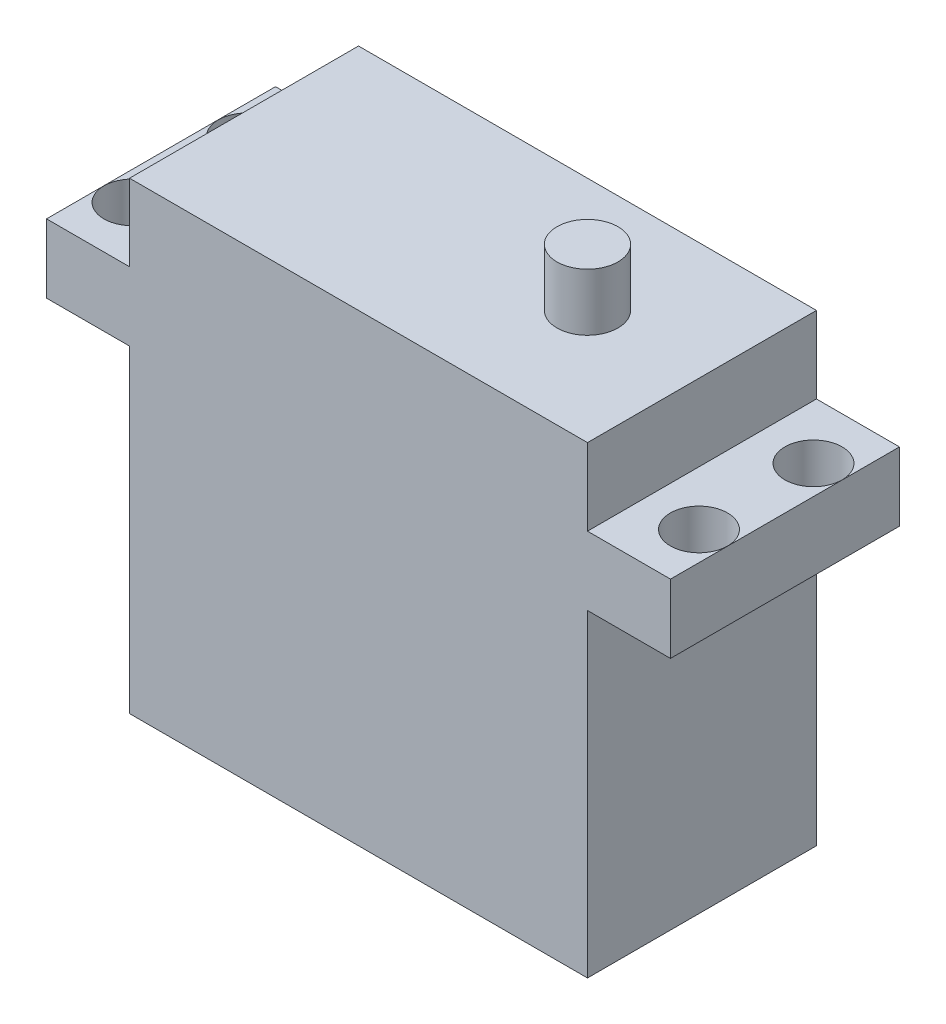
ISO-10303-21;
HEADER;
FILE_DESCRIPTION(('STEP AP214'),'2;1');
FILE_NAME('part.step','',(''),(''),'','','');
FILE_SCHEMA(('AUTOMOTIVE_DESIGN { 1 0 10303 214 1 1 1 1 }'));
ENDSEC;
DATA;
#1=APPLICATION_CONTEXT('core data for automotive mechanical design processes');
#2=APPLICATION_PROTOCOL_DEFINITION('international standard','automotive_design',2000,#1);
#3=PRODUCT_CONTEXT('',#1,'mechanical');
#4=PRODUCT('Part','Part','',(#3));
#5=PRODUCT_RELATED_PRODUCT_CATEGORY('part','',(#4));
#6=PRODUCT_DEFINITION_FORMATION('','',#4);
#7=PRODUCT_DEFINITION_CONTEXT('part definition',#1,'design');
#8=PRODUCT_DEFINITION('design','',#6,#7);
#9=PRODUCT_DEFINITION_SHAPE('','',#8);
#10=(LENGTH_UNIT() NAMED_UNIT(*) SI_UNIT(.MILLI.,.METRE.));
#11=(NAMED_UNIT(*) PLANE_ANGLE_UNIT() SI_UNIT($,.RADIAN.));
#12=(NAMED_UNIT(*) SI_UNIT($,.STERADIAN.) SOLID_ANGLE_UNIT());
#13=UNCERTAINTY_MEASURE_WITH_UNIT(LENGTH_MEASURE(1.E-05),#10,'distance_accuracy_value','');
#14=(GEOMETRIC_REPRESENTATION_CONTEXT(3) GLOBAL_UNCERTAINTY_ASSIGNED_CONTEXT((#13)) GLOBAL_UNIT_ASSIGNED_CONTEXT((#10,
#11,#12)) REPRESENTATION_CONTEXT('',''));
#15=CARTESIAN_POINT('',(0.,0.,0.));
#16=DIRECTION('',(0.,0.,1.));
#17=DIRECTION('',(1.,0.,0.));
#18=AXIS2_PLACEMENT_3D('',#15,#16,#17);
#19=CARTESIAN_POINT('',(20.,40.5,0.));
#20=DIRECTION('',(-1.,0.,0.));
#21=DIRECTION('',(0.,0.,1.));
#22=AXIS2_PLACEMENT_3D('',#19,#20,#21);
#23=PLANE('',#22);
#24=DIRECTION('',(0.,0.,-1.));
#25=VECTOR('',#24,1.);
#26=CARTESIAN_POINT('',(20.,27.8,0.));
#27=LINE('',#26,#25);
#28=CARTESIAN_POINT('',(20.,27.8,10.));
#29=VERTEX_POINT('',#28);
#30=CARTESIAN_POINT('',(20.,27.8,-10.));
#31=VERTEX_POINT('',#30);
#32=EDGE_CURVE('E261',#29,#31,#27,.T.);
#33=ORIENTED_EDGE('',*,*,#32,.F.);
#34=DIRECTION('',(0.,-1.,0.));
#35=VECTOR('',#34,1.);
#36=CARTESIAN_POINT('',(20.,40.5,10.));
#37=LINE('',#36,#35);
#38=CARTESIAN_POINT('',(20.,0.,10.));
#39=VERTEX_POINT('',#38);
#40=EDGE_CURVE('E49',#29,#39,#37,.T.);
#41=ORIENTED_EDGE('',*,*,#40,.T.);
#42=DIRECTION('',(0.,0.,-1.));
#43=VECTOR('',#42,1.);
#44=CARTESIAN_POINT('',(20.,0.,0.));
#45=LINE('',#44,#43);
#46=CARTESIAN_POINT('',(20.,0.,-10.));
#47=VERTEX_POINT('',#46);
#48=EDGE_CURVE('E176',#39,#47,#45,.T.);
#49=ORIENTED_EDGE('',*,*,#48,.T.);
#50=DIRECTION('',(0.,-1.,0.));
#51=VECTOR('',#50,1.);
#52=CARTESIAN_POINT('',(20.,40.5,-10.));
#53=LINE('',#52,#51);
#54=EDGE_CURVE('E185',#31,#47,#53,.T.);
#55=ORIENTED_EDGE('',*,*,#54,.F.);
#56=EDGE_LOOP('',(#33,#41,#49,#55));
#57=FACE_BOUND('',#56,.T.);
#58=ADVANCED_FACE('F41',(#57),#23,.F.);
#59=CARTESIAN_POINT('',(-20.,40.5,0.));
#60=DIRECTION('',(-1.,0.,0.));
#61=DIRECTION('',(0.,0.,1.));
#62=AXIS2_PLACEMENT_3D('',#59,#60,#61);
#63=PLANE('',#62);
#64=DIRECTION('',(0.,-1.,0.));
#65=VECTOR('',#64,1.);
#66=CARTESIAN_POINT('',(-20.,40.5,10.));
#67=LINE('',#66,#65);
#68=CARTESIAN_POINT('',(-20.,27.8,10.));
#69=VERTEX_POINT('',#68);
#70=CARTESIAN_POINT('',(-20.,0.,10.));
#71=VERTEX_POINT('',#70);
#72=EDGE_CURVE('E173',#69,#71,#67,.T.);
#73=ORIENTED_EDGE('',*,*,#72,.F.);
#74=DIRECTION('',(0.,0.,-1.));
#75=VECTOR('',#74,1.);
#76=CARTESIAN_POINT('',(-20.,27.8,0.));
#77=LINE('',#76,#75);
#78=CARTESIAN_POINT('',(-20.,27.8,-10.));
#79=VERTEX_POINT('',#78);
#80=EDGE_CURVE('E64',#69,#79,#77,.T.);
#81=ORIENTED_EDGE('',*,*,#80,.T.);
#82=DIRECTION('',(0.,-1.,0.));
#83=VECTOR('',#82,1.);
#84=CARTESIAN_POINT('',(-20.,40.5,-10.));
#85=LINE('',#84,#83);
#86=CARTESIAN_POINT('',(-20.,0.,-10.));
#87=VERTEX_POINT('',#86);
#88=EDGE_CURVE('E183',#79,#87,#85,.T.);
#89=ORIENTED_EDGE('',*,*,#88,.T.);
#90=DIRECTION('',(0.,0.,-1.));
#91=VECTOR('',#90,1.);
#92=CARTESIAN_POINT('',(-20.,0.,0.));
#93=LINE('',#92,#91);
#94=EDGE_CURVE('E162',#71,#87,#93,.T.);
#95=ORIENTED_EDGE('',*,*,#94,.F.);
#96=EDGE_LOOP('',(#73,#81,#89,#95));
#97=FACE_BOUND('',#96,.T.);
#98=ADVANCED_FACE('F201',(#97),#63,.T.);
#99=CARTESIAN_POINT('',(0.,40.5,10.));
#100=DIRECTION('',(0.,0.,-1.));
#101=DIRECTION('',(-1.,0.,0.));
#102=AXIS2_PLACEMENT_3D('',#99,#100,#101);
#103=PLANE('',#102);
#104=DIRECTION('',(1.,0.,0.));
#105=VECTOR('',#104,1.);
#106=CARTESIAN_POINT('',(0.,0.,10.));
#107=LINE('',#106,#105);
#108=EDGE_CURVE('E174',#71,#39,#107,.T.);
#109=ORIENTED_EDGE('',*,*,#108,.T.);
#110=ORIENTED_EDGE('',*,*,#40,.F.);
#111=DIRECTION('',(1.,0.,0.));
#112=VECTOR('',#111,1.);
#113=CARTESIAN_POINT('',(0.,27.8,10.));
#114=LINE('',#113,#112);
#115=CARTESIAN_POINT('',(27.25,27.8,10.));
#116=VERTEX_POINT('',#115);
#117=EDGE_CURVE('E259',#29,#116,#114,.T.);
#118=ORIENTED_EDGE('',*,*,#117,.T.);
#119=DIRECTION('',(0.,-1.,0.));
#120=VECTOR('',#119,1.);
#121=CARTESIAN_POINT('',(27.25,33.8,10.));
#122=LINE('',#121,#120);
#123=CARTESIAN_POINT('',(27.25,33.8,10.));
#124=VERTEX_POINT('',#123);
#125=EDGE_CURVE('E137',#124,#116,#122,.T.);
#126=ORIENTED_EDGE('',*,*,#125,.F.);
#127=DIRECTION('',(1.,0.,0.));
#128=VECTOR('',#127,1.);
#129=CARTESIAN_POINT('',(0.,33.8,10.));
#130=LINE('',#129,#128);
#131=CARTESIAN_POINT('',(20.,33.8,10.));
#132=VERTEX_POINT('',#131);
#133=EDGE_CURVE('E132',#132,#124,#130,.T.);
#134=ORIENTED_EDGE('',*,*,#133,.F.);
#135=CARTESIAN_POINT('',(20.,40.5,10.));
#136=VERTEX_POINT('',#135);
#137=EDGE_CURVE('E11',#136,#132,#37,.T.);
#138=ORIENTED_EDGE('',*,*,#137,.F.);
#139=DIRECTION('',(1.,0.,0.));
#140=VECTOR('',#139,1.);
#141=CARTESIAN_POINT('',(0.,40.5,10.));
#142=LINE('',#141,#140);
#143=CARTESIAN_POINT('',(-20.,40.5,10.));
#144=VERTEX_POINT('',#143);
#145=EDGE_CURVE('E155',#144,#136,#142,.T.);
#146=ORIENTED_EDGE('',*,*,#145,.F.);
#147=CARTESIAN_POINT('',(-20.,33.8,10.));
#148=VERTEX_POINT('',#147);
#149=EDGE_CURVE('E181',#144,#148,#67,.T.);
#150=ORIENTED_EDGE('',*,*,#149,.T.);
#151=DIRECTION('',(1.,0.,0.));
#152=VECTOR('',#151,1.);
#153=CARTESIAN_POINT('',(0.,33.8,10.));
#154=LINE('',#153,#152);
#155=CARTESIAN_POINT('',(-27.25,33.8,10.));
#156=VERTEX_POINT('',#155);
#157=EDGE_CURVE('E242',#156,#148,#154,.T.);
#158=ORIENTED_EDGE('',*,*,#157,.F.);
#159=DIRECTION('',(0.,-1.,0.));
#160=VECTOR('',#159,1.);
#161=CARTESIAN_POINT('',(-27.25,33.8,10.));
#162=LINE('',#161,#160);
#163=CARTESIAN_POINT('',(-27.25,27.8,10.));
#164=VERTEX_POINT('',#163);
#165=EDGE_CURVE('E218',#156,#164,#162,.T.);
#166=ORIENTED_EDGE('',*,*,#165,.T.);
#167=DIRECTION('',(1.,0.,0.));
#168=VECTOR('',#167,1.);
#169=CARTESIAN_POINT('',(0.,27.8,10.));
#170=LINE('',#169,#168);
#171=EDGE_CURVE('E215',#164,#69,#170,.T.);
#172=ORIENTED_EDGE('',*,*,#171,.T.);
#173=ORIENTED_EDGE('',*,*,#72,.T.);
#174=EDGE_LOOP('',(#109,#110,#118,#126,#134,#138,#146,#150,#158,#166,#172,#173));
#175=FACE_BOUND('',#174,.T.);
#176=ADVANCED_FACE('F43',(#175),#103,.F.);
#177=ORIENTED_EDGE('',*,*,#137,.T.);
#178=DIRECTION('',(0.,0.,-1.));
#179=VECTOR('',#178,1.);
#180=CARTESIAN_POINT('',(20.,33.8,0.));
#181=LINE('',#180,#179);
#182=CARTESIAN_POINT('',(20.,33.8,-10.));
#183=VERTEX_POINT('',#182);
#184=EDGE_CURVE('E139',#132,#183,#181,.T.);
#185=ORIENTED_EDGE('',*,*,#184,.T.);
#186=CARTESIAN_POINT('',(20.,40.5,-10.));
#187=VERTEX_POINT('',#186);
#188=EDGE_CURVE('E150',#187,#183,#53,.T.);
#189=ORIENTED_EDGE('',*,*,#188,.F.);
#190=DIRECTION('',(0.,0.,-1.));
#191=VECTOR('',#190,1.);
#192=CARTESIAN_POINT('',(20.,40.5,0.));
#193=LINE('',#192,#191);
#194=EDGE_CURVE('E148',#136,#187,#193,.T.);
#195=ORIENTED_EDGE('',*,*,#194,.F.);
#196=EDGE_LOOP('',(#177,#185,#189,#195));
#197=FACE_BOUND('',#196,.T.);
#198=ADVANCED_FACE('F147',(#197),#23,.F.);
#199=CARTESIAN_POINT('',(0.,40.5,-10.));
#200=DIRECTION('',(0.,0.,-1.));
#201=DIRECTION('',(-1.,0.,0.));
#202=AXIS2_PLACEMENT_3D('',#199,#200,#201);
#203=PLANE('',#202);
#204=DIRECTION('',(1.,0.,0.));
#205=VECTOR('',#204,1.);
#206=CARTESIAN_POINT('',(0.,0.,-10.));
#207=LINE('',#206,#205);
#208=EDGE_CURVE('E165',#87,#47,#207,.T.);
#209=ORIENTED_EDGE('',*,*,#208,.F.);
#210=ORIENTED_EDGE('',*,*,#88,.F.);
#211=DIRECTION('',(1.,0.,0.));
#212=VECTOR('',#211,1.);
#213=CARTESIAN_POINT('',(0.,27.8,-10.));
#214=LINE('',#213,#212);
#215=CARTESIAN_POINT('',(-27.25,27.8,-10.));
#216=VERTEX_POINT('',#215);
#217=EDGE_CURVE('E204',#216,#79,#214,.T.);
#218=ORIENTED_EDGE('',*,*,#217,.F.);
#219=DIRECTION('',(0.,-1.,0.));
#220=VECTOR('',#219,1.);
#221=CARTESIAN_POINT('',(-27.25,33.8,-10.));
#222=LINE('',#221,#220);
#223=CARTESIAN_POINT('',(-27.25,33.8,-10.));
#224=VERTEX_POINT('',#223);
#225=EDGE_CURVE('E168',#224,#216,#222,.T.);
#226=ORIENTED_EDGE('',*,*,#225,.F.);
#227=DIRECTION('',(1.,0.,0.));
#228=VECTOR('',#227,1.);
#229=CARTESIAN_POINT('',(0.,33.8,-10.));
#230=LINE('',#229,#228);
#231=CARTESIAN_POINT('',(-20.,33.8,-10.));
#232=VERTEX_POINT('',#231);
#233=EDGE_CURVE('E222',#224,#232,#230,.T.);
#234=ORIENTED_EDGE('',*,*,#233,.T.);
#235=CARTESIAN_POINT('',(-20.,40.5,-10.));
#236=VERTEX_POINT('',#235);
#237=EDGE_CURVE('E184',#236,#232,#85,.T.);
#238=ORIENTED_EDGE('',*,*,#237,.F.);
#239=DIRECTION('',(1.,0.,0.));
#240=VECTOR('',#239,1.);
#241=CARTESIAN_POINT('',(0.,40.5,-10.));
#242=LINE('',#241,#240);
#243=EDGE_CURVE('E154',#236,#187,#242,.T.);
#244=ORIENTED_EDGE('',*,*,#243,.T.);
#245=ORIENTED_EDGE('',*,*,#188,.T.);
#246=DIRECTION('',(1.,0.,0.));
#247=VECTOR('',#246,1.);
#248=CARTESIAN_POINT('',(0.,33.8,-10.));
#249=LINE('',#248,#247);
#250=CARTESIAN_POINT('',(27.25,33.8,-10.));
#251=VERTEX_POINT('',#250);
#252=EDGE_CURVE('E56',#183,#251,#249,.T.);
#253=ORIENTED_EDGE('',*,*,#252,.T.);
#254=DIRECTION('',(0.,-1.,0.));
#255=VECTOR('',#254,1.);
#256=CARTESIAN_POINT('',(27.25,33.8,-10.));
#257=LINE('',#256,#255);
#258=CARTESIAN_POINT('',(27.25,27.8,-10.));
#259=VERTEX_POINT('',#258);
#260=EDGE_CURVE('E252',#251,#259,#257,.T.);
#261=ORIENTED_EDGE('',*,*,#260,.T.);
#262=DIRECTION('',(1.,0.,0.));
#263=VECTOR('',#262,1.);
#264=CARTESIAN_POINT('',(0.,27.8,-10.));
#265=LINE('',#264,#263);
#266=EDGE_CURVE('E192',#31,#259,#265,.T.);
#267=ORIENTED_EDGE('',*,*,#266,.F.);
#268=ORIENTED_EDGE('',*,*,#54,.T.);
#269=EDGE_LOOP('',(#209,#210,#218,#226,#234,#238,#244,#245,#253,#261,#267,#268));
#270=FACE_BOUND('',#269,.T.);
#271=ADVANCED_FACE('F190',(#270),#203,.T.);
#272=DIRECTION('',(0.,0.,-1.));
#273=VECTOR('',#272,1.);
#274=CARTESIAN_POINT('',(-20.,33.8,0.));
#275=LINE('',#274,#273);
#276=EDGE_CURVE('E227',#148,#232,#275,.T.);
#277=ORIENTED_EDGE('',*,*,#276,.F.);
#278=ORIENTED_EDGE('',*,*,#149,.F.);
#279=DIRECTION('',(0.,0.,-1.));
#280=VECTOR('',#279,1.);
#281=CARTESIAN_POINT('',(-20.,40.5,0.));
#282=LINE('',#281,#280);
#283=EDGE_CURVE('E160',#144,#236,#282,.T.);
#284=ORIENTED_EDGE('',*,*,#283,.T.);
#285=ORIENTED_EDGE('',*,*,#237,.T.);
#286=EDGE_LOOP('',(#277,#278,#284,#285));
#287=FACE_BOUND('',#286,.T.);
#288=ADVANCED_FACE('F304',(#287),#63,.T.);
#289=CARTESIAN_POINT('',(0.,40.5,0.));
#290=DIRECTION('',(0.,1.,0.));
#291=DIRECTION('',(0.,0.,1.));
#292=AXIS2_PLACEMENT_3D('',#289,#290,#291);
#293=PLANE('',#292);
#294=CARTESIAN_POINT('',(10.,40.5,0.));
#295=DIRECTION('',(0.,1.,0.));
#296=DIRECTION('',(0.,0.,1.));
#297=AXIS2_PLACEMENT_3D('',#294,#295,#296);
#298=CIRCLE('',#297,2.66521145439413);
#299=CARTESIAN_POINT('',(10.,40.5,2.66521145439413));
#300=VERTEX_POINT('',#299);
#301=EDGE_CURVE('E269',#300,#300,#298,.F.);
#302=ORIENTED_EDGE('',*,*,#301,.T.);
#303=EDGE_LOOP('',(#302));
#304=FACE_BOUND('',#303,.T.);
#305=ORIENTED_EDGE('',*,*,#145,.T.);
#306=ORIENTED_EDGE('',*,*,#194,.T.);
#307=ORIENTED_EDGE('',*,*,#243,.F.);
#308=ORIENTED_EDGE('',*,*,#283,.F.);
#309=EDGE_LOOP('',(#305,#306,#307,#308));
#310=FACE_BOUND('',#309,.T.);
#311=ADVANCED_FACE('F158',(#304,#310),#293,.T.);
#312=CARTESIAN_POINT('',(0.,0.,0.));
#313=DIRECTION('',(0.,1.,0.));
#314=DIRECTION('',(0.,0.,1.));
#315=AXIS2_PLACEMENT_3D('',#312,#313,#314);
#316=PLANE('',#315);
#317=ORIENTED_EDGE('',*,*,#108,.F.);
#318=ORIENTED_EDGE('',*,*,#94,.T.);
#319=ORIENTED_EDGE('',*,*,#208,.T.);
#320=ORIENTED_EDGE('',*,*,#48,.F.);
#321=EDGE_LOOP('',(#317,#318,#319,#320));
#322=FACE_BOUND('',#321,.T.);
#323=ADVANCED_FACE('F199',(#322),#316,.F.);
#324=CARTESIAN_POINT('',(-24.74,33.8,-5.));
#325=DIRECTION('',(0.,-1.,0.));
#326=DIRECTION('',(0.,0.,-1.));
#327=AXIS2_PLACEMENT_3D('',#324,#325,#326);
#328=CYLINDRICAL_SURFACE('',#327,2.5);
#329=CARTESIAN_POINT('',(-24.74,33.8,-5.));
#330=DIRECTION('',(0.,1.,0.));
#331=DIRECTION('',(0.,0.,1.));
#332=AXIS2_PLACEMENT_3D('',#329,#330,#331);
#333=CIRCLE('',#332,2.5);
#334=CARTESIAN_POINT('',(-24.74,33.8,-2.5));
#335=VERTEX_POINT('',#334);
#336=EDGE_CURVE('E244',#335,#335,#333,.T.);
#337=ORIENTED_EDGE('',*,*,#336,.T.);
#338=EDGE_LOOP('',(#337));
#339=FACE_BOUND('',#338,.T.);
#340=CARTESIAN_POINT('',(-24.74,27.8,-5.));
#341=DIRECTION('',(0.,1.,0.));
#342=DIRECTION('',(0.,0.,1.));
#343=AXIS2_PLACEMENT_3D('',#340,#341,#342);
#344=CIRCLE('',#343,2.5);
#345=CARTESIAN_POINT('',(-24.74,27.8,-2.5));
#346=VERTEX_POINT('',#345);
#347=EDGE_CURVE('E234',#346,#346,#344,.T.);
#348=ORIENTED_EDGE('',*,*,#347,.F.);
#349=EDGE_LOOP('',(#348));
#350=FACE_BOUND('',#349,.T.);
#351=ADVANCED_FACE('F377',(#339,#350),#328,.F.);
#352=CARTESIAN_POINT('',(-24.74,33.8,5.00000000000001));
#353=DIRECTION('',(0.,-1.,0.));
#354=DIRECTION('',(0.,0.,-1.));
#355=AXIS2_PLACEMENT_3D('',#352,#353,#354);
#356=CYLINDRICAL_SURFACE('',#355,2.5);
#357=CARTESIAN_POINT('',(-24.74,33.8,5.00000000000001));
#358=DIRECTION('',(0.,1.,0.));
#359=DIRECTION('',(0.,0.,1.));
#360=AXIS2_PLACEMENT_3D('',#357,#358,#359);
#361=CIRCLE('',#360,2.5);
#362=CARTESIAN_POINT('',(-24.74,33.8,7.50000000000001));
#363=VERTEX_POINT('',#362);
#364=EDGE_CURVE('E213',#363,#363,#361,.T.);
#365=ORIENTED_EDGE('',*,*,#364,.T.);
#366=EDGE_LOOP('',(#365));
#367=FACE_BOUND('',#366,.T.);
#368=CARTESIAN_POINT('',(-24.74,27.8,5.00000000000001));
#369=DIRECTION('',(0.,1.,0.));
#370=DIRECTION('',(0.,0.,1.));
#371=AXIS2_PLACEMENT_3D('',#368,#369,#370);
#372=CIRCLE('',#371,2.5);
#373=CARTESIAN_POINT('',(-24.74,27.8,7.50000000000001));
#374=VERTEX_POINT('',#373);
#375=EDGE_CURVE('E231',#374,#374,#372,.T.);
#376=ORIENTED_EDGE('',*,*,#375,.F.);
#377=EDGE_LOOP('',(#376));
#378=FACE_BOUND('',#377,.T.);
#379=ADVANCED_FACE('F379',(#367,#378),#356,.F.);
#380=CARTESIAN_POINT('',(-27.25,33.8,0.));
#381=DIRECTION('',(-1.,0.,0.));
#382=DIRECTION('',(0.,0.,1.));
#383=AXIS2_PLACEMENT_3D('',#380,#381,#382);
#384=PLANE('',#383);
#385=DIRECTION('',(0.,0.,-1.));
#386=VECTOR('',#385,1.);
#387=CARTESIAN_POINT('',(-27.25,27.8,0.));
#388=LINE('',#387,#386);
#389=EDGE_CURVE('E211',#164,#216,#388,.T.);
#390=ORIENTED_EDGE('',*,*,#389,.F.);
#391=ORIENTED_EDGE('',*,*,#165,.F.);
#392=DIRECTION('',(0.,0.,-1.));
#393=VECTOR('',#392,1.);
#394=CARTESIAN_POINT('',(-27.25,33.8,0.));
#395=LINE('',#394,#393);
#396=EDGE_CURVE('E219',#156,#224,#395,.T.);
#397=ORIENTED_EDGE('',*,*,#396,.T.);
#398=ORIENTED_EDGE('',*,*,#225,.T.);
#399=EDGE_LOOP('',(#390,#391,#397,#398));
#400=FACE_BOUND('',#399,.T.);
#401=ADVANCED_FACE('F236',(#400),#384,.T.);
#402=CARTESIAN_POINT('',(0.,33.8,0.));
#403=DIRECTION('',(0.,1.,0.));
#404=DIRECTION('',(0.,0.,1.));
#405=AXIS2_PLACEMENT_3D('',#402,#403,#404);
#406=PLANE('',#405);
#407=ORIENTED_EDGE('',*,*,#364,.F.);
#408=EDGE_LOOP('',(#407));
#409=FACE_BOUND('',#408,.T.);
#410=ORIENTED_EDGE('',*,*,#336,.F.);
#411=EDGE_LOOP('',(#410));
#412=FACE_BOUND('',#411,.T.);
#413=ORIENTED_EDGE('',*,*,#157,.T.);
#414=ORIENTED_EDGE('',*,*,#276,.T.);
#415=ORIENTED_EDGE('',*,*,#233,.F.);
#416=ORIENTED_EDGE('',*,*,#396,.F.);
#417=EDGE_LOOP('',(#413,#414,#415,#416));
#418=FACE_BOUND('',#417,.T.);
#419=ADVANCED_FACE('F241',(#409,#412,#418),#406,.T.);
#420=CARTESIAN_POINT('',(0.,27.8,0.));
#421=DIRECTION('',(0.,1.,0.));
#422=DIRECTION('',(0.,0.,1.));
#423=AXIS2_PLACEMENT_3D('',#420,#421,#422);
#424=PLANE('',#423);
#425=ORIENTED_EDGE('',*,*,#375,.T.);
#426=EDGE_LOOP('',(#425));
#427=FACE_BOUND('',#426,.T.);
#428=ORIENTED_EDGE('',*,*,#347,.T.);
#429=EDGE_LOOP('',(#428));
#430=FACE_BOUND('',#429,.T.);
#431=ORIENTED_EDGE('',*,*,#171,.F.);
#432=ORIENTED_EDGE('',*,*,#389,.T.);
#433=ORIENTED_EDGE('',*,*,#217,.T.);
#434=ORIENTED_EDGE('',*,*,#80,.F.);
#435=EDGE_LOOP('',(#431,#432,#433,#434));
#436=FACE_BOUND('',#435,.T.);
#437=ADVANCED_FACE('F208',(#427,#430,#436),#424,.F.);
#438=CARTESIAN_POINT('',(27.25,33.8,0.));
#439=DIRECTION('',(-1.,0.,0.));
#440=DIRECTION('',(0.,0.,1.));
#441=AXIS2_PLACEMENT_3D('',#438,#439,#440);
#442=PLANE('',#441);
#443=DIRECTION('',(0.,0.,-1.));
#444=VECTOR('',#443,1.);
#445=CARTESIAN_POINT('',(27.25,27.8,0.));
#446=LINE('',#445,#444);
#447=EDGE_CURVE('E256',#116,#259,#446,.T.);
#448=ORIENTED_EDGE('',*,*,#447,.T.);
#449=ORIENTED_EDGE('',*,*,#260,.F.);
#450=DIRECTION('',(0.,0.,-1.));
#451=VECTOR('',#450,1.);
#452=CARTESIAN_POINT('',(27.25,33.8,0.));
#453=LINE('',#452,#451);
#454=EDGE_CURVE('E138',#124,#251,#453,.T.);
#455=ORIENTED_EDGE('',*,*,#454,.F.);
#456=ORIENTED_EDGE('',*,*,#125,.T.);
#457=EDGE_LOOP('',(#448,#449,#455,#456));
#458=FACE_BOUND('',#457,.T.);
#459=ADVANCED_FACE('F390',(#458),#442,.F.);
#460=CARTESIAN_POINT('',(24.74,33.8,-5.));
#461=DIRECTION('',(0.,-1.,0.));
#462=DIRECTION('',(0.,0.,-1.));
#463=AXIS2_PLACEMENT_3D('',#460,#461,#462);
#464=CYLINDRICAL_SURFACE('',#463,2.5);
#465=CARTESIAN_POINT('',(24.74,33.8,-5.));
#466=DIRECTION('',(0.,1.,0.));
#467=DIRECTION('',(0.,0.,1.));
#468=AXIS2_PLACEMENT_3D('',#465,#466,#467);
#469=CIRCLE('',#468,2.5);
#470=CARTESIAN_POINT('',(24.74,33.8,-2.5));
#471=VERTEX_POINT('',#470);
#472=EDGE_CURVE('E145',#471,#471,#469,.T.);
#473=ORIENTED_EDGE('',*,*,#472,.T.);
#474=EDGE_LOOP('',(#473));
#475=FACE_BOUND('',#474,.T.);
#476=CARTESIAN_POINT('',(24.74,27.8,-5.));
#477=DIRECTION('',(0.,1.,0.));
#478=DIRECTION('',(0.,0.,1.));
#479=AXIS2_PLACEMENT_3D('',#476,#477,#478);
#480=CIRCLE('',#479,2.5);
#481=CARTESIAN_POINT('',(24.74,27.8,-2.5));
#482=VERTEX_POINT('',#481);
#483=EDGE_CURVE('E263',#482,#482,#480,.T.);
#484=ORIENTED_EDGE('',*,*,#483,.F.);
#485=EDGE_LOOP('',(#484));
#486=FACE_BOUND('',#485,.T.);
#487=ADVANCED_FACE('F398',(#475,#486),#464,.F.);
#488=CARTESIAN_POINT('',(24.74,33.8,5.));
#489=DIRECTION('',(0.,-1.,0.));
#490=DIRECTION('',(0.,0.,-1.));
#491=AXIS2_PLACEMENT_3D('',#488,#489,#490);
#492=CYLINDRICAL_SURFACE('',#491,2.5);
#493=CARTESIAN_POINT('',(24.74,33.8,5.));
#494=DIRECTION('',(0.,1.,0.));
#495=DIRECTION('',(0.,0.,1.));
#496=AXIS2_PLACEMENT_3D('',#493,#494,#495);
#497=CIRCLE('',#496,2.5);
#498=CARTESIAN_POINT('',(24.74,33.8,7.5));
#499=VERTEX_POINT('',#498);
#500=EDGE_CURVE('E255',#499,#499,#497,.T.);
#501=ORIENTED_EDGE('',*,*,#500,.T.);
#502=EDGE_LOOP('',(#501));
#503=FACE_BOUND('',#502,.T.);
#504=CARTESIAN_POINT('',(24.74,27.8,5.));
#505=DIRECTION('',(0.,1.,0.));
#506=DIRECTION('',(0.,0.,1.));
#507=AXIS2_PLACEMENT_3D('',#504,#505,#506);
#508=CIRCLE('',#507,2.5);
#509=CARTESIAN_POINT('',(24.74,27.8,7.5));
#510=VERTEX_POINT('',#509);
#511=EDGE_CURVE('E266',#510,#510,#508,.T.);
#512=ORIENTED_EDGE('',*,*,#511,.F.);
#513=EDGE_LOOP('',(#512));
#514=FACE_BOUND('',#513,.T.);
#515=ADVANCED_FACE('F395',(#503,#514),#492,.F.);
#516=CARTESIAN_POINT('',(0.,33.8,0.));
#517=DIRECTION('',(0.,1.,0.));
#518=DIRECTION('',(0.,0.,1.));
#519=AXIS2_PLACEMENT_3D('',#516,#517,#518);
#520=PLANE('',#519);
#521=ORIENTED_EDGE('',*,*,#500,.F.);
#522=EDGE_LOOP('',(#521));
#523=FACE_BOUND('',#522,.T.);
#524=ORIENTED_EDGE('',*,*,#472,.F.);
#525=EDGE_LOOP('',(#524));
#526=FACE_BOUND('',#525,.T.);
#527=ORIENTED_EDGE('',*,*,#184,.F.);
#528=ORIENTED_EDGE('',*,*,#133,.T.);
#529=ORIENTED_EDGE('',*,*,#454,.T.);
#530=ORIENTED_EDGE('',*,*,#252,.F.);
#531=EDGE_LOOP('',(#527,#528,#529,#530));
#532=FACE_BOUND('',#531,.T.);
#533=ADVANCED_FACE('F141',(#523,#526,#532),#520,.T.);
#534=CARTESIAN_POINT('',(0.,27.8,0.));
#535=DIRECTION('',(0.,1.,0.));
#536=DIRECTION('',(0.,0.,1.));
#537=AXIS2_PLACEMENT_3D('',#534,#535,#536);
#538=PLANE('',#537);
#539=ORIENTED_EDGE('',*,*,#511,.T.);
#540=EDGE_LOOP('',(#539));
#541=FACE_BOUND('',#540,.T.);
#542=ORIENTED_EDGE('',*,*,#483,.T.);
#543=EDGE_LOOP('',(#542));
#544=FACE_BOUND('',#543,.T.);
#545=ORIENTED_EDGE('',*,*,#32,.T.);
#546=ORIENTED_EDGE('',*,*,#266,.T.);
#547=ORIENTED_EDGE('',*,*,#447,.F.);
#548=ORIENTED_EDGE('',*,*,#117,.F.);
#549=EDGE_LOOP('',(#545,#546,#547,#548));
#550=FACE_BOUND('',#549,.T.);
#551=ADVANCED_FACE('F286',(#541,#544,#550),#538,.F.);
#552=CARTESIAN_POINT('',(10.,45.5,0.));
#553=DIRECTION('',(0.,-1.,0.));
#554=DIRECTION('',(0.,0.,-1.));
#555=AXIS2_PLACEMENT_3D('',#552,#553,#554);
#556=CYLINDRICAL_SURFACE('',#555,2.66521145439413);
#557=ORIENTED_EDGE('',*,*,#301,.F.);
#558=EDGE_LOOP('',(#557));
#559=FACE_BOUND('',#558,.T.);
#560=CARTESIAN_POINT('',(10.,45.5,0.));
#561=DIRECTION('',(0.,1.,0.));
#562=DIRECTION('',(0.,0.,1.));
#563=AXIS2_PLACEMENT_3D('',#560,#561,#562);
#564=CIRCLE('',#563,2.66521145439413);
#565=CARTESIAN_POINT('',(10.,45.5,2.66521145439413));
#566=VERTEX_POINT('',#565);
#567=EDGE_CURVE('E278',#566,#566,#564,.T.);
#568=ORIENTED_EDGE('',*,*,#567,.F.);
#569=EDGE_LOOP('',(#568));
#570=FACE_BOUND('',#569,.T.);
#571=ADVANCED_FACE('F284',(#559,#570),#556,.T.);
#572=CARTESIAN_POINT('',(0.,45.5,0.));
#573=DIRECTION('',(0.,1.,0.));
#574=DIRECTION('',(0.,0.,1.));
#575=AXIS2_PLACEMENT_3D('',#572,#573,#574);
#576=PLANE('',#575);
#577=ORIENTED_EDGE('',*,*,#567,.T.);
#578=EDGE_LOOP('',(#577));
#579=FACE_BOUND('',#578,.T.);
#580=ADVANCED_FACE('F282',(#579),#576,.T.);
#581=CLOSED_SHELL('',(#58,#98,#176,#198,#271,#288,#311,#323,#351,#379,#401,#419,#437,#459,#487,
#515,#533,#551,#571,#580));
#582=MANIFOLD_SOLID_BREP('B2',#581);
#583=ADVANCED_BREP_SHAPE_REPRESENTATION('',(#18,#582),#14);
#584=SHAPE_DEFINITION_REPRESENTATION(#9,#583);
ENDSEC;
END-ISO-10303-21;
